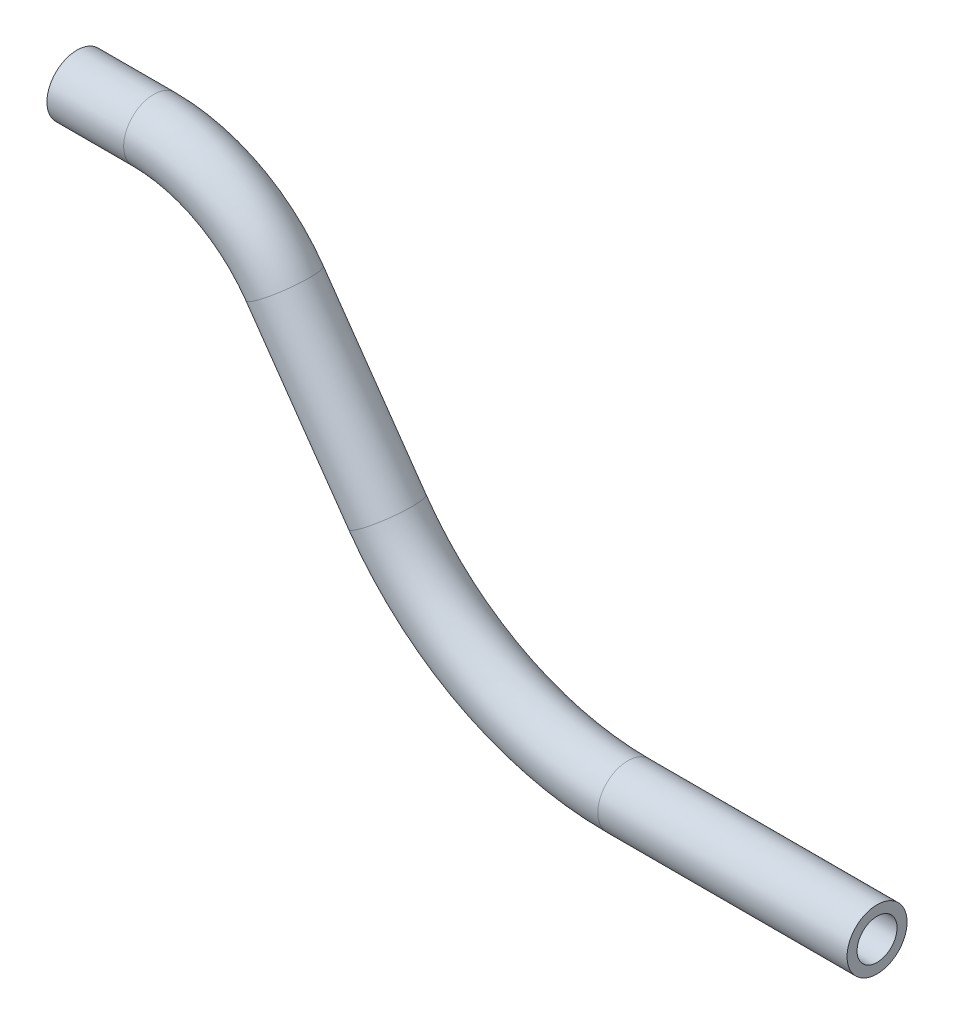
ISO-10303-21;
HEADER;
FILE_DESCRIPTION(('STEP AP214'),'2;1');
FILE_NAME('part.step','',(''),(''),'','','');
FILE_SCHEMA(('AUTOMOTIVE_DESIGN { 1 0 10303 214 1 1 1 1 }'));
ENDSEC;
DATA;
#1=APPLICATION_CONTEXT('core data for automotive mechanical design processes');
#2=APPLICATION_PROTOCOL_DEFINITION('international standard','automotive_design',2000,#1);
#3=PRODUCT_CONTEXT('',#1,'mechanical');
#4=PRODUCT('Part','Part','',(#3));
#5=PRODUCT_RELATED_PRODUCT_CATEGORY('part','',(#4));
#6=PRODUCT_DEFINITION_FORMATION('','',#4);
#7=PRODUCT_DEFINITION_CONTEXT('part definition',#1,'design');
#8=PRODUCT_DEFINITION('design','',#6,#7);
#9=PRODUCT_DEFINITION_SHAPE('','',#8);
#10=(LENGTH_UNIT() NAMED_UNIT(*) SI_UNIT(.MILLI.,.METRE.));
#11=(NAMED_UNIT(*) PLANE_ANGLE_UNIT() SI_UNIT($,.RADIAN.));
#12=(NAMED_UNIT(*) SI_UNIT($,.STERADIAN.) SOLID_ANGLE_UNIT());
#13=UNCERTAINTY_MEASURE_WITH_UNIT(LENGTH_MEASURE(1.E-05),#10,'distance_accuracy_value','');
#14=(GEOMETRIC_REPRESENTATION_CONTEXT(3) GLOBAL_UNCERTAINTY_ASSIGNED_CONTEXT((#13)) GLOBAL_UNIT_ASSIGNED_CONTEXT((#10,
#11,#12)) REPRESENTATION_CONTEXT('',''));
#15=CARTESIAN_POINT('',(0.,0.,0.));
#16=DIRECTION('',(0.,0.,1.));
#17=DIRECTION('',(1.,0.,0.));
#18=AXIS2_PLACEMENT_3D('',#15,#16,#17);
#19=CARTESIAN_POINT('',(413.077673364861,-255.,0.));
#20=DIRECTION('',(1.,0.,0.));
#21=DIRECTION('',(0.,0.,-1.));
#22=AXIS2_PLACEMENT_3D('',#19,#20,#21);
#23=CYLINDRICAL_SURFACE('',#22,22.5);
#24=CARTESIAN_POINT('',(413.077673364861,-255.,0.));
#25=DIRECTION('',(1.,0.,0.));
#26=DIRECTION('',(0.,0.,-1.));
#27=AXIS2_PLACEMENT_3D('',#24,#25,#26);
#28=CIRCLE('',#27,22.5);
#29=CARTESIAN_POINT('',(413.077673364861,-277.5,0.));
#30=VERTEX_POINT('',#29);
#31=EDGE_CURVE('E41',#30,#30,#28,.T.);
#32=ORIENTED_EDGE('',*,*,#31,.T.);
#33=EDGE_LOOP('',(#32));
#34=FACE_BOUND('',#33,.T.);
#35=CARTESIAN_POINT('',(600.,-255.,0.));
#36=DIRECTION('',(1.,0.,0.));
#37=DIRECTION('',(0.,0.,-1.));
#38=AXIS2_PLACEMENT_3D('',#35,#36,#37);
#39=CIRCLE('',#38,22.5);
#40=CARTESIAN_POINT('',(600.,-255.,-22.5));
#41=VERTEX_POINT('',#40);
#42=EDGE_CURVE('E10',#41,#41,#39,.T.);
#43=ORIENTED_EDGE('',*,*,#42,.F.);
#44=EDGE_LOOP('',(#43));
#45=FACE_BOUND('',#44,.T.);
#46=ADVANCED_FACE('F31',(#34,#45),#23,.T.);
#47=CARTESIAN_POINT('',(413.077673364861,-255.,0.));
#48=DIRECTION('',(1.,0.,0.));
#49=DIRECTION('',(0.,0.,-1.));
#50=AXIS2_PLACEMENT_3D('',#47,#48,#49);
#51=CYLINDRICAL_SURFACE('',#50,15.);
#52=CARTESIAN_POINT('',(413.077673364861,-255.,0.));
#53=DIRECTION('',(1.,0.,0.));
#54=DIRECTION('',(0.,0.,-1.));
#55=AXIS2_PLACEMENT_3D('',#52,#53,#54);
#56=CIRCLE('',#55,15.);
#57=CARTESIAN_POINT('',(413.077673364861,-270.,0.));
#58=VERTEX_POINT('',#57);
#59=EDGE_CURVE('E45',#58,#58,#56,.T.);
#60=ORIENTED_EDGE('',*,*,#59,.F.);
#61=EDGE_LOOP('',(#60));
#62=FACE_BOUND('',#61,.T.);
#63=CARTESIAN_POINT('',(600.,-255.,0.));
#64=DIRECTION('',(1.,0.,0.));
#65=DIRECTION('',(0.,0.,-1.));
#66=AXIS2_PLACEMENT_3D('',#63,#64,#65);
#67=CIRCLE('',#66,15.);
#68=CARTESIAN_POINT('',(600.,-255.,-15.));
#69=VERTEX_POINT('',#68);
#70=EDGE_CURVE('E37',#69,#69,#67,.T.);
#71=ORIENTED_EDGE('',*,*,#70,.T.);
#72=EDGE_LOOP('',(#71));
#73=FACE_BOUND('',#72,.T.);
#74=ADVANCED_FACE('F99',(#62,#73),#51,.F.);
#75=CARTESIAN_POINT('',(413.07767336486,-35.0000000000001,0.));
#76=DIRECTION('',(0.,0.,1.));
#77=DIRECTION('',(1.,0.,0.));
#78=AXIS2_PLACEMENT_3D('',#75,#76,#77);
#79=TOROIDAL_SURFACE('',#78,220.,22.5);
#80=CARTESIAN_POINT('',(232.864223621281,-161.186815997229,0.));
#81=DIRECTION('',(0.573576436351037,-0.819152044288998,0.));
#82=DIRECTION('',(0.,0.,-1.));
#83=AXIS2_PLACEMENT_3D('',#80,#81,#82);
#84=CIRCLE('',#83,22.5);
#85=CARTESIAN_POINT('',(214.433302624778,-174.092285815127,0.));
#86=VERTEX_POINT('',#85);
#87=EDGE_CURVE('E50',#86,#86,#84,.T.);
#88=CARTESIAN_POINT('',(413.07767336486,-35.0000000000001,0.));
#89=DIRECTION('',(0.,0.,1.));
#90=DIRECTION('',(1.,0.,0.));
#91=AXIS2_PLACEMENT_3D('',#88,#89,#90);
#92=CIRCLE('',#91,242.5);
#93=EDGE_CURVE('',#86,#30,#92,.T.);
#94=ORIENTED_EDGE('',*,*,#87,.T.);
#95=ORIENTED_EDGE('',*,*,#31,.F.);
#96=ORIENTED_EDGE('',*,*,#93,.T.);
#97=ORIENTED_EDGE('',*,*,#93,.F.);
#98=EDGE_LOOP('',(#94,#96,#95,#97));
#99=FACE_BOUND('',#98,.T.);
#100=ADVANCED_FACE('F95',(#99),#79,.T.);
#101=CARTESIAN_POINT('',(413.07767336486,-35.0000000000001,0.));
#102=DIRECTION('',(0.,0.,1.));
#103=DIRECTION('',(1.,0.,0.));
#104=AXIS2_PLACEMENT_3D('',#101,#102,#103);
#105=TOROIDAL_SURFACE('',#104,220.,15.);
#106=CARTESIAN_POINT('',(232.864223621281,-161.186815997229,0.));
#107=DIRECTION('',(0.573576436351037,-0.819152044288998,0.));
#108=DIRECTION('',(0.,0.,-1.));
#109=AXIS2_PLACEMENT_3D('',#106,#107,#108);
#110=CIRCLE('',#109,15.);
#111=CARTESIAN_POINT('',(220.576942956946,-169.790462542495,0.));
#112=VERTEX_POINT('',#111);
#113=EDGE_CURVE('E53',#112,#112,#110,.T.);
#114=CARTESIAN_POINT('',(413.07767336486,-35.0000000000001,0.));
#115=DIRECTION('',(0.,0.,1.));
#116=DIRECTION('',(1.,0.,0.));
#117=AXIS2_PLACEMENT_3D('',#114,#115,#116);
#118=CIRCLE('',#117,235.);
#119=EDGE_CURVE('',#112,#58,#118,.T.);
#120=ORIENTED_EDGE('',*,*,#113,.F.);
#121=ORIENTED_EDGE('',*,*,#59,.T.);
#122=ORIENTED_EDGE('',*,*,#119,.T.);
#123=ORIENTED_EDGE('',*,*,#119,.F.);
#124=EDGE_LOOP('',(#120,#122,#121,#123));
#125=FACE_BOUND('',#124,.T.);
#126=ADVANCED_FACE('F92',(#125),#105,.F.);
#127=CARTESIAN_POINT('',(155.83019924847,-51.1708276378751,0.));
#128=DIRECTION('',(0.573576436351044,-0.819152044288993,0.));
#129=DIRECTION('',(0.819152044288993,0.573576436351044,0.));
#130=AXIS2_PLACEMENT_3D('',#127,#128,#129);
#131=CYLINDRICAL_SURFACE('',#130,22.5);
#132=CARTESIAN_POINT('',(155.83019924847,-51.1708276378751,0.));
#133=DIRECTION('',(0.573576436351037,-0.819152044288998,0.));
#134=DIRECTION('',(0.,0.,-1.));
#135=AXIS2_PLACEMENT_3D('',#132,#133,#134);
#136=CIRCLE('',#135,22.5);
#137=CARTESIAN_POINT('',(174.261120244972,-38.2653578199767,0.));
#138=VERTEX_POINT('',#137);
#139=EDGE_CURVE('E56',#138,#138,#136,.T.);
#140=ORIENTED_EDGE('',*,*,#139,.T.);
#141=EDGE_LOOP('',(#140));
#142=FACE_BOUND('',#141,.T.);
#143=ORIENTED_EDGE('',*,*,#87,.F.);
#144=EDGE_LOOP('',(#143));
#145=FACE_BOUND('',#144,.T.);
#146=ADVANCED_FACE('F88',(#142,#145),#131,.T.);
#147=CARTESIAN_POINT('',(155.83019924847,-51.1708276378751,0.));
#148=DIRECTION('',(0.573576436351044,-0.819152044288993,0.));
#149=DIRECTION('',(0.819152044288993,0.573576436351044,0.));
#150=AXIS2_PLACEMENT_3D('',#147,#148,#149);
#151=CYLINDRICAL_SURFACE('',#150,15.);
#152=CARTESIAN_POINT('',(155.83019924847,-51.1708276378751,0.));
#153=DIRECTION('',(0.573576436351037,-0.819152044288998,0.));
#154=DIRECTION('',(0.,0.,-1.));
#155=AXIS2_PLACEMENT_3D('',#152,#153,#154);
#156=CIRCLE('',#155,15.);
#157=CARTESIAN_POINT('',(168.117479912805,-42.5671810926095,0.));
#158=VERTEX_POINT('',#157);
#159=EDGE_CURVE('E59',#158,#158,#156,.T.);
#160=ORIENTED_EDGE('',*,*,#159,.F.);
#161=EDGE_LOOP('',(#160));
#162=FACE_BOUND('',#161,.T.);
#163=ORIENTED_EDGE('',*,*,#113,.T.);
#164=EDGE_LOOP('',(#163));
#165=FACE_BOUND('',#164,.T.);
#166=ADVANCED_FACE('F85',(#162,#165),#151,.F.);
#167=CARTESIAN_POINT('',(57.5319539337903,-120.,0.));
#168=DIRECTION('',(0.,0.,-1.));
#169=DIRECTION('',(-1.,0.,0.));
#170=AXIS2_PLACEMENT_3D('',#167,#168,#169);
#171=TOROIDAL_SURFACE('',#170,120.,22.5);
#172=CARTESIAN_POINT('',(57.5319539337898,0.,0.));
#173=DIRECTION('',(1.,0.,0.));
#174=DIRECTION('',(0.,0.,-1.));
#175=AXIS2_PLACEMENT_3D('',#172,#173,#174);
#176=CIRCLE('',#175,22.5);
#177=CARTESIAN_POINT('',(57.5319539337897,22.5,0.));
#178=VERTEX_POINT('',#177);
#179=EDGE_CURVE('E62',#178,#178,#176,.T.);
#180=CARTESIAN_POINT('',(57.5319539337903,-120.,0.));
#181=DIRECTION('',(0.,0.,-1.));
#182=DIRECTION('',(-1.,0.,0.));
#183=AXIS2_PLACEMENT_3D('',#180,#181,#182);
#184=CIRCLE('',#183,142.5);
#185=EDGE_CURVE('',#178,#138,#184,.T.);
#186=ORIENTED_EDGE('',*,*,#179,.T.);
#187=ORIENTED_EDGE('',*,*,#139,.F.);
#188=ORIENTED_EDGE('',*,*,#185,.T.);
#189=ORIENTED_EDGE('',*,*,#185,.F.);
#190=EDGE_LOOP('',(#186,#188,#187,#189));
#191=FACE_BOUND('',#190,.T.);
#192=ADVANCED_FACE('F81',(#191),#171,.T.);
#193=CARTESIAN_POINT('',(57.5319539337903,-120.,0.));
#194=DIRECTION('',(0.,0.,-1.));
#195=DIRECTION('',(-1.,0.,0.));
#196=AXIS2_PLACEMENT_3D('',#193,#194,#195);
#197=TOROIDAL_SURFACE('',#196,120.,15.);
#198=CARTESIAN_POINT('',(57.5319539337898,0.,0.));
#199=DIRECTION('',(1.,0.,0.));
#200=DIRECTION('',(0.,0.,-1.));
#201=AXIS2_PLACEMENT_3D('',#198,#199,#200);
#202=CIRCLE('',#201,15.);
#203=CARTESIAN_POINT('',(57.5319539337897,15.,0.));
#204=VERTEX_POINT('',#203);
#205=EDGE_CURVE('E66',#204,#204,#202,.T.);
#206=CARTESIAN_POINT('',(57.5319539337903,-120.,0.));
#207=DIRECTION('',(0.,0.,-1.));
#208=DIRECTION('',(-1.,0.,0.));
#209=AXIS2_PLACEMENT_3D('',#206,#207,#208);
#210=CIRCLE('',#209,135.);
#211=EDGE_CURVE('',#204,#158,#210,.T.);
#212=ORIENTED_EDGE('',*,*,#205,.F.);
#213=ORIENTED_EDGE('',*,*,#159,.T.);
#214=ORIENTED_EDGE('',*,*,#211,.T.);
#215=ORIENTED_EDGE('',*,*,#211,.F.);
#216=EDGE_LOOP('',(#212,#214,#213,#215));
#217=FACE_BOUND('',#216,.T.);
#218=ADVANCED_FACE('F78',(#217),#197,.F.);
#219=CARTESIAN_POINT('',(57.5319539337898,0.,0.));
#220=DIRECTION('',(-1.,0.,0.));
#221=DIRECTION('',(0.,0.,1.));
#222=AXIS2_PLACEMENT_3D('',#219,#220,#221);
#223=CYLINDRICAL_SURFACE('',#222,15.);
#224=ORIENTED_EDGE('',*,*,#205,.T.);
#225=EDGE_LOOP('',(#224));
#226=FACE_BOUND('',#225,.T.);
#227=CARTESIAN_POINT('',(0.,0.,0.));
#228=DIRECTION('',(1.,0.,0.));
#229=DIRECTION('',(0.,0.,-1.));
#230=AXIS2_PLACEMENT_3D('',#227,#228,#229);
#231=CIRCLE('',#230,15.);
#232=CARTESIAN_POINT('',(0.,0.,-15.));
#233=VERTEX_POINT('',#232);
#234=EDGE_CURVE('E67',#233,#233,#231,.T.);
#235=ORIENTED_EDGE('',*,*,#234,.F.);
#236=EDGE_LOOP('',(#235));
#237=FACE_BOUND('',#236,.T.);
#238=ADVANCED_FACE('F75',(#226,#237),#223,.F.);
#239=CARTESIAN_POINT('',(57.5319539337898,0.,0.));
#240=DIRECTION('',(-1.,0.,0.));
#241=DIRECTION('',(0.,0.,1.));
#242=AXIS2_PLACEMENT_3D('',#239,#240,#241);
#243=CYLINDRICAL_SURFACE('',#242,22.5);
#244=ORIENTED_EDGE('',*,*,#179,.F.);
#245=EDGE_LOOP('',(#244));
#246=FACE_BOUND('',#245,.T.);
#247=CARTESIAN_POINT('',(0.,0.,0.));
#248=DIRECTION('',(1.,0.,0.));
#249=DIRECTION('',(0.,0.,-1.));
#250=AXIS2_PLACEMENT_3D('',#247,#248,#249);
#251=CIRCLE('',#250,22.5);
#252=CARTESIAN_POINT('',(0.,0.,-22.5));
#253=VERTEX_POINT('',#252);
#254=EDGE_CURVE('E63',#253,#253,#251,.T.);
#255=ORIENTED_EDGE('',*,*,#254,.T.);
#256=EDGE_LOOP('',(#255));
#257=FACE_BOUND('',#256,.T.);
#258=ADVANCED_FACE('F117',(#246,#257),#243,.T.);
#259=CARTESIAN_POINT('',(600.,-255.,0.));
#260=DIRECTION('',(1.,0.,0.));
#261=DIRECTION('',(0.,0.,-1.));
#262=AXIS2_PLACEMENT_3D('',#259,#260,#261);
#263=PLANE('',#262);
#264=ORIENTED_EDGE('',*,*,#70,.F.);
#265=EDGE_LOOP('',(#264));
#266=FACE_BOUND('',#265,.T.);
#267=ORIENTED_EDGE('',*,*,#42,.T.);
#268=EDGE_LOOP('',(#267));
#269=FACE_BOUND('',#268,.T.);
#270=ADVANCED_FACE('F120',(#266,#269),#263,.T.);
#271=CARTESIAN_POINT('',(0.,0.,0.));
#272=DIRECTION('',(1.,0.,0.));
#273=DIRECTION('',(0.,0.,-1.));
#274=AXIS2_PLACEMENT_3D('',#271,#272,#273);
#275=PLANE('',#274);
#276=ORIENTED_EDGE('',*,*,#234,.T.);
#277=EDGE_LOOP('',(#276));
#278=FACE_BOUND('',#277,.T.);
#279=ORIENTED_EDGE('',*,*,#254,.F.);
#280=EDGE_LOOP('',(#279));
#281=FACE_BOUND('',#280,.T.);
#282=ADVANCED_FACE('F122',(#278,#281),#275,.F.);
#283=CLOSED_SHELL('',(#46,#74,#100,#126,#146,#166,#192,#218,#238,#258,#270,#282));
#284=MANIFOLD_SOLID_BREP('B2',#283);
#285=ADVANCED_BREP_SHAPE_REPRESENTATION('',(#18,#284),#14);
#286=SHAPE_DEFINITION_REPRESENTATION(#9,#285);
ENDSEC;
END-ISO-10303-21;
